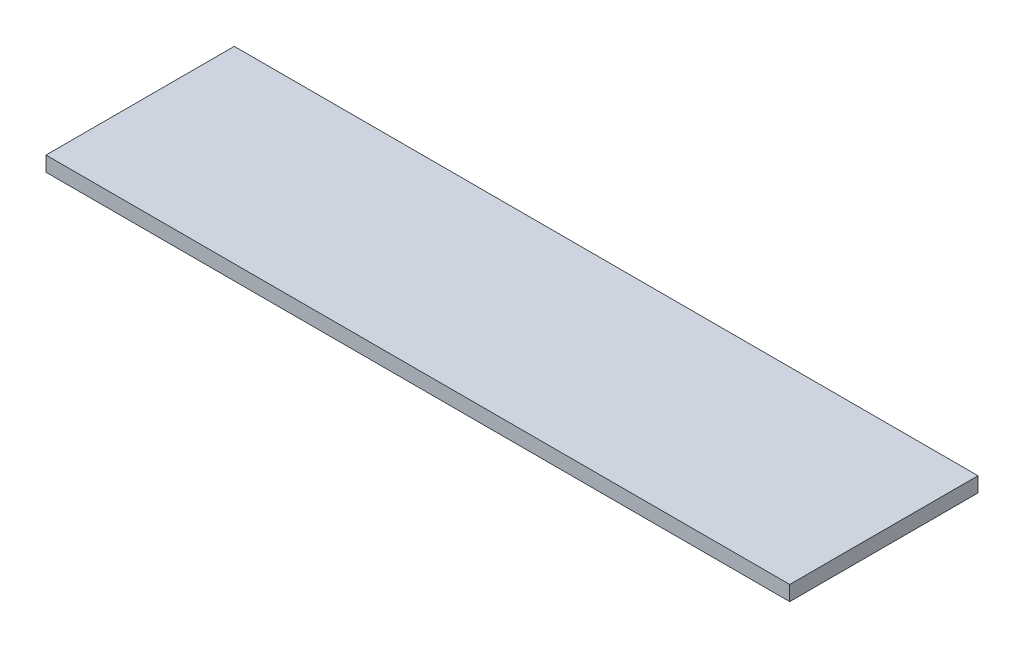
ISO-10303-21;
HEADER;
FILE_DESCRIPTION(('STEP AP214'),'2;1');
FILE_NAME('part.step','',(''),(''),'','','');
FILE_SCHEMA(('AUTOMOTIVE_DESIGN { 1 0 10303 214 1 1 1 1 }'));
ENDSEC;
DATA;
#1=APPLICATION_CONTEXT('core data for automotive mechanical design processes');
#2=APPLICATION_PROTOCOL_DEFINITION('international standard','automotive_design',2000,#1);
#3=PRODUCT_CONTEXT('',#1,'mechanical');
#4=PRODUCT('Part','Part','',(#3));
#5=PRODUCT_RELATED_PRODUCT_CATEGORY('part','',(#4));
#6=PRODUCT_DEFINITION_FORMATION('','',#4);
#7=PRODUCT_DEFINITION_CONTEXT('part definition',#1,'design');
#8=PRODUCT_DEFINITION('design','',#6,#7);
#9=PRODUCT_DEFINITION_SHAPE('','',#8);
#10=(LENGTH_UNIT() NAMED_UNIT(*) SI_UNIT(.MILLI.,.METRE.));
#11=(NAMED_UNIT(*) PLANE_ANGLE_UNIT() SI_UNIT($,.RADIAN.));
#12=(NAMED_UNIT(*) SI_UNIT($,.STERADIAN.) SOLID_ANGLE_UNIT());
#13=UNCERTAINTY_MEASURE_WITH_UNIT(LENGTH_MEASURE(1.E-05),#10,'distance_accuracy_value','');
#14=(GEOMETRIC_REPRESENTATION_CONTEXT(3) GLOBAL_UNCERTAINTY_ASSIGNED_CONTEXT((#13)) GLOBAL_UNIT_ASSIGNED_CONTEXT((#10,
#11,#12)) REPRESENTATION_CONTEXT('',''));
#15=CARTESIAN_POINT('',(0.,0.,0.));
#16=DIRECTION('',(0.,0.,1.));
#17=DIRECTION('',(1.,0.,0.));
#18=AXIS2_PLACEMENT_3D('',#15,#16,#17);
#19=CARTESIAN_POINT('',(-149.509985432985,6.,-37.8507016280295));
#20=DIRECTION('',(0.,0.,1.));
#21=DIRECTION('',(1.,0.,0.));
#22=AXIS2_PLACEMENT_3D('',#19,#20,#21);
#23=PLANE('',#22);
#24=DIRECTION('',(-1.,0.,0.));
#25=VECTOR('',#24,1.);
#26=CARTESIAN_POINT('',(-149.509985432985,0.,-37.8507016280295));
#27=LINE('',#26,#25);
#28=CARTESIAN_POINT('',(149.509985432985,0.,-37.8507016280295));
#29=VERTEX_POINT('',#28);
#30=CARTESIAN_POINT('',(-149.509985432985,0.,-37.8507016280295));
#31=VERTEX_POINT('',#30);
#32=EDGE_CURVE('E73',#29,#31,#27,.T.);
#33=ORIENTED_EDGE('',*,*,#32,.T.);
#34=DIRECTION('',(0.,-1.,0.));
#35=VECTOR('',#34,1.);
#36=CARTESIAN_POINT('',(-149.509985432985,6.,-37.8507016280295));
#37=LINE('',#36,#35);
#38=CARTESIAN_POINT('',(-149.509985432985,6.,-37.8507016280295));
#39=VERTEX_POINT('',#38);
#40=EDGE_CURVE('E11',#39,#31,#37,.T.);
#41=ORIENTED_EDGE('',*,*,#40,.F.);
#42=DIRECTION('',(-1.,0.,0.));
#43=VECTOR('',#42,1.);
#44=CARTESIAN_POINT('',(7.68793205022761,6.,-37.8507016280295));
#45=LINE('',#44,#43);
#46=CARTESIAN_POINT('',(149.509985432985,6.,-37.8507016280295));
#47=VERTEX_POINT('',#46);
#48=EDGE_CURVE('E78',#47,#39,#45,.T.);
#49=ORIENTED_EDGE('',*,*,#48,.F.);
#50=DIRECTION('',(0.,-1.,0.));
#51=VECTOR('',#50,1.);
#52=CARTESIAN_POINT('',(149.509985432985,6.,-37.8507016280295));
#53=LINE('',#52,#51);
#54=EDGE_CURVE('E93',#47,#29,#53,.T.);
#55=ORIENTED_EDGE('',*,*,#54,.T.);
#56=EDGE_LOOP('',(#33,#41,#49,#55));
#57=FACE_BOUND('',#56,.T.);
#58=ADVANCED_FACE('F33',(#57),#23,.F.);
#59=CARTESIAN_POINT('',(-149.509985432985,6.,37.8507016280295));
#60=DIRECTION('',(1.,0.,0.));
#61=DIRECTION('',(0.,0.,-1.));
#62=AXIS2_PLACEMENT_3D('',#59,#60,#61);
#63=PLANE('',#62);
#64=DIRECTION('',(0.,0.,1.));
#65=VECTOR('',#64,1.);
#66=CARTESIAN_POINT('',(-149.509985432985,0.,37.8507016280295));
#67=LINE('',#66,#65);
#68=CARTESIAN_POINT('',(-149.509985432985,0.,37.8507016280295));
#69=VERTEX_POINT('',#68);
#70=EDGE_CURVE('E89',#31,#69,#67,.T.);
#71=ORIENTED_EDGE('',*,*,#70,.T.);
#72=DIRECTION('',(0.,-1.,0.));
#73=VECTOR('',#72,1.);
#74=CARTESIAN_POINT('',(-149.509985432985,6.,37.8507016280295));
#75=LINE('',#74,#73);
#76=CARTESIAN_POINT('',(-149.509985432985,6.,37.8507016280295));
#77=VERTEX_POINT('',#76);
#78=EDGE_CURVE('E41',#77,#69,#75,.T.);
#79=ORIENTED_EDGE('',*,*,#78,.F.);
#80=DIRECTION('',(0.,0.,1.));
#81=VECTOR('',#80,1.);
#82=CARTESIAN_POINT('',(-149.509985432985,6.,37.8507016280295));
#83=LINE('',#82,#81);
#84=EDGE_CURVE('E81',#39,#77,#83,.T.);
#85=ORIENTED_EDGE('',*,*,#84,.F.);
#86=ORIENTED_EDGE('',*,*,#40,.T.);
#87=EDGE_LOOP('',(#71,#79,#85,#86));
#88=FACE_BOUND('',#87,.T.);
#89=ADVANCED_FACE('F88',(#88),#63,.F.);
#90=CARTESIAN_POINT('',(-149.509985432985,6.,37.8507016280295));
#91=DIRECTION('',(0.,0.,-1.));
#92=DIRECTION('',(-1.,0.,0.));
#93=AXIS2_PLACEMENT_3D('',#90,#91,#92);
#94=PLANE('',#93);
#95=DIRECTION('',(1.,0.,0.));
#96=VECTOR('',#95,1.);
#97=CARTESIAN_POINT('',(-149.509985432985,0.,37.8507016280295));
#98=LINE('',#97,#96);
#99=CARTESIAN_POINT('',(149.509985432985,0.,37.8507016280295));
#100=VERTEX_POINT('',#99);
#101=EDGE_CURVE('E66',#69,#100,#98,.T.);
#102=ORIENTED_EDGE('',*,*,#101,.T.);
#103=DIRECTION('',(0.,-1.,0.));
#104=VECTOR('',#103,1.);
#105=CARTESIAN_POINT('',(149.509985432985,6.,37.8507016280295));
#106=LINE('',#105,#104);
#107=CARTESIAN_POINT('',(149.509985432985,6.,37.8507016280295));
#108=VERTEX_POINT('',#107);
#109=EDGE_CURVE('E90',#108,#100,#106,.T.);
#110=ORIENTED_EDGE('',*,*,#109,.F.);
#111=DIRECTION('',(1.,0.,0.));
#112=VECTOR('',#111,1.);
#113=CARTESIAN_POINT('',(-149.509985432985,6.,37.8507016280295));
#114=LINE('',#113,#112);
#115=EDGE_CURVE('E85',#77,#108,#114,.T.);
#116=ORIENTED_EDGE('',*,*,#115,.F.);
#117=ORIENTED_EDGE('',*,*,#78,.T.);
#118=EDGE_LOOP('',(#102,#110,#116,#117));
#119=FACE_BOUND('',#118,.T.);
#120=ADVANCED_FACE('F91',(#119),#94,.F.);
#121=CARTESIAN_POINT('',(149.509985432985,6.,37.8507016280295));
#122=DIRECTION('',(-1.,0.,0.));
#123=DIRECTION('',(0.,0.,1.));
#124=AXIS2_PLACEMENT_3D('',#121,#122,#123);
#125=PLANE('',#124);
#126=DIRECTION('',(0.,0.,-1.));
#127=VECTOR('',#126,1.);
#128=CARTESIAN_POINT('',(149.509985432985,0.,37.8507016280295));
#129=LINE('',#128,#127);
#130=EDGE_CURVE('E100',#100,#29,#129,.T.);
#131=ORIENTED_EDGE('',*,*,#130,.T.);
#132=ORIENTED_EDGE('',*,*,#54,.F.);
#133=DIRECTION('',(0.,0.,-1.));
#134=VECTOR('',#133,1.);
#135=CARTESIAN_POINT('',(149.509985432985,6.,37.8507016280295));
#136=LINE('',#135,#134);
#137=EDGE_CURVE('E49',#108,#47,#136,.T.);
#138=ORIENTED_EDGE('',*,*,#137,.F.);
#139=ORIENTED_EDGE('',*,*,#109,.T.);
#140=EDGE_LOOP('',(#131,#132,#138,#139));
#141=FACE_BOUND('',#140,.T.);
#142=ADVANCED_FACE('F105',(#141),#125,.F.);
#143=CARTESIAN_POINT('',(0.,6.,0.));
#144=DIRECTION('',(0.,1.,0.));
#145=DIRECTION('',(0.,0.,1.));
#146=AXIS2_PLACEMENT_3D('',#143,#144,#145);
#147=PLANE('',#146);
#148=ORIENTED_EDGE('',*,*,#48,.T.);
#149=ORIENTED_EDGE('',*,*,#84,.T.);
#150=ORIENTED_EDGE('',*,*,#115,.T.);
#151=ORIENTED_EDGE('',*,*,#137,.T.);
#152=EDGE_LOOP('',(#148,#149,#150,#151));
#153=FACE_BOUND('',#152,.T.);
#154=ADVANCED_FACE('F83',(#153),#147,.T.);
#155=CARTESIAN_POINT('',(0.,0.,0.));
#156=DIRECTION('',(0.,1.,0.));
#157=DIRECTION('',(0.,0.,1.));
#158=AXIS2_PLACEMENT_3D('',#155,#156,#157);
#159=PLANE('',#158);
#160=ORIENTED_EDGE('',*,*,#32,.F.);
#161=ORIENTED_EDGE('',*,*,#130,.F.);
#162=ORIENTED_EDGE('',*,*,#101,.F.);
#163=ORIENTED_EDGE('',*,*,#70,.F.);
#164=EDGE_LOOP('',(#160,#161,#162,#163));
#165=FACE_BOUND('',#164,.T.);
#166=ADVANCED_FACE('F106',(#165),#159,.F.);
#167=CLOSED_SHELL('',(#58,#89,#120,#142,#154,#166));
#168=MANIFOLD_SOLID_BREP('B2',#167);
#169=ADVANCED_BREP_SHAPE_REPRESENTATION('',(#18,#168),#14);
#170=SHAPE_DEFINITION_REPRESENTATION(#9,#169);
ENDSEC;
END-ISO-10303-21;
